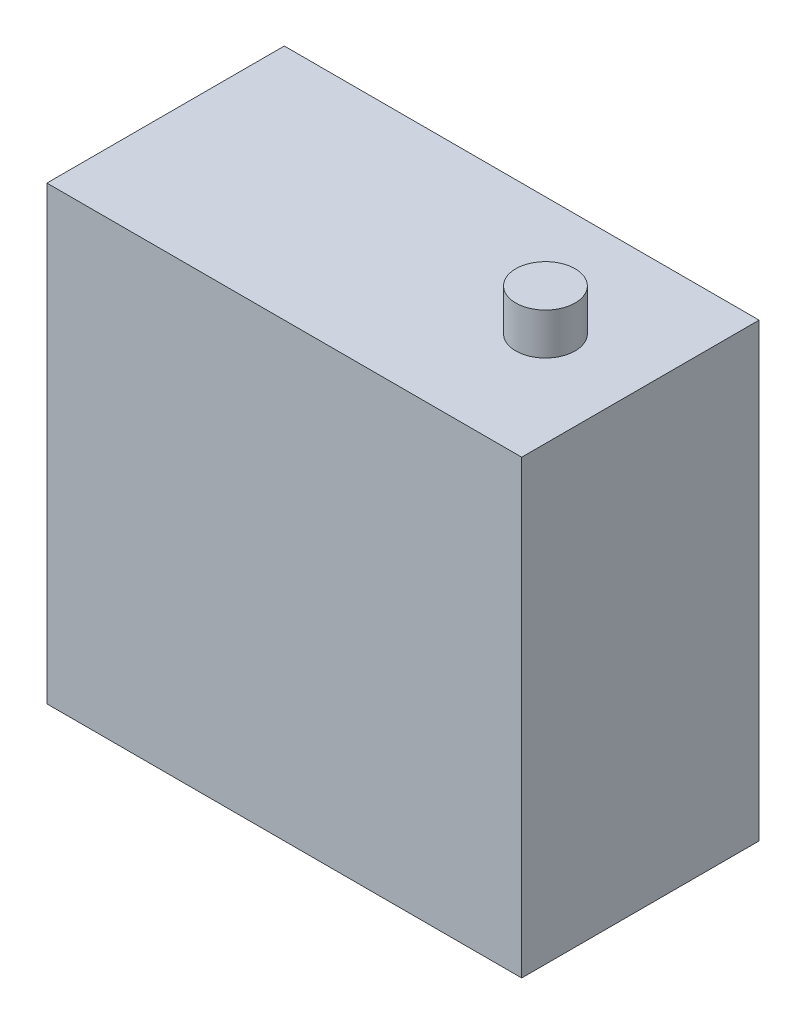
ISO-10303-21;
HEADER;
FILE_DESCRIPTION(('STEP AP214'),'2;1');
FILE_NAME('part.step','',(''),(''),'','','');
FILE_SCHEMA(('AUTOMOTIVE_DESIGN { 1 0 10303 214 1 1 1 1 }'));
ENDSEC;
DATA;
#1=APPLICATION_CONTEXT('core data for automotive mechanical design processes');
#2=APPLICATION_PROTOCOL_DEFINITION('international standard','automotive_design',2000,#1);
#3=PRODUCT_CONTEXT('',#1,'mechanical');
#4=PRODUCT('Part','Part','',(#3));
#5=PRODUCT_RELATED_PRODUCT_CATEGORY('part','',(#4));
#6=PRODUCT_DEFINITION_FORMATION('','',#4);
#7=PRODUCT_DEFINITION_CONTEXT('part definition',#1,'design');
#8=PRODUCT_DEFINITION('design','',#6,#7);
#9=PRODUCT_DEFINITION_SHAPE('','',#8);
#10=(LENGTH_UNIT() NAMED_UNIT(*) SI_UNIT(.MILLI.,.METRE.));
#11=(NAMED_UNIT(*) PLANE_ANGLE_UNIT() SI_UNIT($,.RADIAN.));
#12=(NAMED_UNIT(*) SI_UNIT($,.STERADIAN.) SOLID_ANGLE_UNIT());
#13=UNCERTAINTY_MEASURE_WITH_UNIT(LENGTH_MEASURE(1.E-05),#10,'distance_accuracy_value','');
#14=(GEOMETRIC_REPRESENTATION_CONTEXT(3) GLOBAL_UNCERTAINTY_ASSIGNED_CONTEXT((#13)) GLOBAL_UNIT_ASSIGNED_CONTEXT((#10,
#11,#12)) REPRESENTATION_CONTEXT('',''));
#15=CARTESIAN_POINT('',(0.,0.,0.));
#16=DIRECTION('',(0.,0.,1.));
#17=DIRECTION('',(1.,0.,0.));
#18=AXIS2_PLACEMENT_3D('',#15,#16,#17);
#19=CARTESIAN_POINT('',(-20.,38.,10.));
#20=DIRECTION('',(1.,0.,0.));
#21=DIRECTION('',(0.,0.,-1.));
#22=AXIS2_PLACEMENT_3D('',#19,#20,#21);
#23=PLANE('',#22);
#24=DIRECTION('',(0.,0.,1.));
#25=VECTOR('',#24,1.);
#26=CARTESIAN_POINT('',(-20.,0.,10.));
#27=LINE('',#26,#25);
#28=CARTESIAN_POINT('',(-20.,0.,-10.));
#29=VERTEX_POINT('',#28);
#30=CARTESIAN_POINT('',(-20.,0.,10.));
#31=VERTEX_POINT('',#30);
#32=EDGE_CURVE('E98',#29,#31,#27,.T.);
#33=ORIENTED_EDGE('',*,*,#32,.T.);
#34=DIRECTION('',(0.,-1.,0.));
#35=VECTOR('',#34,1.);
#36=CARTESIAN_POINT('',(-20.,38.,10.));
#37=LINE('',#36,#35);
#38=CARTESIAN_POINT('',(-20.,38.,10.));
#39=VERTEX_POINT('',#38);
#40=EDGE_CURVE('E11',#39,#31,#37,.T.);
#41=ORIENTED_EDGE('',*,*,#40,.F.);
#42=DIRECTION('',(0.,0.,1.));
#43=VECTOR('',#42,1.);
#44=CARTESIAN_POINT('',(-20.,38.,10.));
#45=LINE('',#44,#43);
#46=CARTESIAN_POINT('',(-20.,38.,-10.));
#47=VERTEX_POINT('',#46);
#48=EDGE_CURVE('E86',#47,#39,#45,.T.);
#49=ORIENTED_EDGE('',*,*,#48,.F.);
#50=DIRECTION('',(0.,-1.,0.));
#51=VECTOR('',#50,1.);
#52=CARTESIAN_POINT('',(-20.,38.,-10.));
#53=LINE('',#52,#51);
#54=EDGE_CURVE('E94',#47,#29,#53,.T.);
#55=ORIENTED_EDGE('',*,*,#54,.T.);
#56=EDGE_LOOP('',(#33,#41,#49,#55));
#57=FACE_BOUND('',#56,.T.);
#58=ADVANCED_FACE('F35',(#57),#23,.F.);
#59=CARTESIAN_POINT('',(20.,38.,10.));
#60=DIRECTION('',(0.,0.,-1.));
#61=DIRECTION('',(-1.,0.,0.));
#62=AXIS2_PLACEMENT_3D('',#59,#60,#61);
#63=PLANE('',#62);
#64=DIRECTION('',(1.,0.,0.));
#65=VECTOR('',#64,1.);
#66=CARTESIAN_POINT('',(20.,0.,10.));
#67=LINE('',#66,#65);
#68=CARTESIAN_POINT('',(20.,0.,10.));
#69=VERTEX_POINT('',#68);
#70=EDGE_CURVE('E90',#31,#69,#67,.T.);
#71=ORIENTED_EDGE('',*,*,#70,.T.);
#72=DIRECTION('',(0.,-1.,0.));
#73=VECTOR('',#72,1.);
#74=CARTESIAN_POINT('',(20.,38.,10.));
#75=LINE('',#74,#73);
#76=CARTESIAN_POINT('',(20.,38.,10.));
#77=VERTEX_POINT('',#76);
#78=EDGE_CURVE('E43',#77,#69,#75,.T.);
#79=ORIENTED_EDGE('',*,*,#78,.F.);
#80=DIRECTION('',(1.,0.,0.));
#81=VECTOR('',#80,1.);
#82=CARTESIAN_POINT('',(20.,38.,10.));
#83=LINE('',#82,#81);
#84=EDGE_CURVE('E81',#39,#77,#83,.T.);
#85=ORIENTED_EDGE('',*,*,#84,.F.);
#86=ORIENTED_EDGE('',*,*,#40,.T.);
#87=EDGE_LOOP('',(#71,#79,#85,#86));
#88=FACE_BOUND('',#87,.T.);
#89=ADVANCED_FACE('F89',(#88),#63,.F.);
#90=CARTESIAN_POINT('',(20.,38.,10.));
#91=DIRECTION('',(-1.,0.,0.));
#92=DIRECTION('',(0.,0.,1.));
#93=AXIS2_PLACEMENT_3D('',#90,#91,#92);
#94=PLANE('',#93);
#95=DIRECTION('',(0.,0.,-1.));
#96=VECTOR('',#95,1.);
#97=CARTESIAN_POINT('',(20.,0.,10.));
#98=LINE('',#97,#96);
#99=CARTESIAN_POINT('',(20.,0.,-10.));
#100=VERTEX_POINT('',#99);
#101=EDGE_CURVE('E68',#69,#100,#98,.T.);
#102=ORIENTED_EDGE('',*,*,#101,.T.);
#103=DIRECTION('',(0.,-1.,0.));
#104=VECTOR('',#103,1.);
#105=CARTESIAN_POINT('',(20.,38.,-10.));
#106=LINE('',#105,#104);
#107=CARTESIAN_POINT('',(20.,38.,-10.));
#108=VERTEX_POINT('',#107);
#109=EDGE_CURVE('E91',#108,#100,#106,.T.);
#110=ORIENTED_EDGE('',*,*,#109,.F.);
#111=DIRECTION('',(0.,0.,-1.));
#112=VECTOR('',#111,1.);
#113=CARTESIAN_POINT('',(20.,38.,10.));
#114=LINE('',#113,#112);
#115=EDGE_CURVE('E84',#77,#108,#114,.T.);
#116=ORIENTED_EDGE('',*,*,#115,.F.);
#117=ORIENTED_EDGE('',*,*,#78,.T.);
#118=EDGE_LOOP('',(#102,#110,#116,#117));
#119=FACE_BOUND('',#118,.T.);
#120=ADVANCED_FACE('F92',(#119),#94,.F.);
#121=CARTESIAN_POINT('',(20.,38.,-10.));
#122=DIRECTION('',(0.,0.,1.));
#123=DIRECTION('',(1.,0.,0.));
#124=AXIS2_PLACEMENT_3D('',#121,#122,#123);
#125=PLANE('',#124);
#126=DIRECTION('',(-1.,0.,0.));
#127=VECTOR('',#126,1.);
#128=CARTESIAN_POINT('',(20.,0.,-10.));
#129=LINE('',#128,#127);
#130=EDGE_CURVE('E74',#100,#29,#129,.T.);
#131=ORIENTED_EDGE('',*,*,#130,.T.);
#132=ORIENTED_EDGE('',*,*,#54,.F.);
#133=DIRECTION('',(-1.,0.,0.));
#134=VECTOR('',#133,1.);
#135=CARTESIAN_POINT('',(20.,38.,-10.));
#136=LINE('',#135,#134);
#137=EDGE_CURVE('E51',#108,#47,#136,.T.);
#138=ORIENTED_EDGE('',*,*,#137,.F.);
#139=ORIENTED_EDGE('',*,*,#109,.T.);
#140=EDGE_LOOP('',(#131,#132,#138,#139));
#141=FACE_BOUND('',#140,.T.);
#142=ADVANCED_FACE('F106',(#141),#125,.F.);
#143=CARTESIAN_POINT('',(0.,38.,0.));
#144=DIRECTION('',(0.,1.,0.));
#145=DIRECTION('',(0.,0.,1.));
#146=AXIS2_PLACEMENT_3D('',#143,#144,#145);
#147=PLANE('',#146);
#148=CARTESIAN_POINT('',(12.,38.,0.));
#149=DIRECTION('',(0.,1.,0.));
#150=DIRECTION('',(0.,0.,1.));
#151=AXIS2_PLACEMENT_3D('',#148,#149,#150);
#152=CIRCLE('',#151,2.5);
#153=CARTESIAN_POINT('',(12.,38.,2.5));
#154=VERTEX_POINT('',#153);
#155=EDGE_CURVE('E112',#154,#154,#152,.T.);
#156=ORIENTED_EDGE('',*,*,#155,.F.);
#157=EDGE_LOOP('',(#156));
#158=FACE_BOUND('',#157,.T.);
#159=ORIENTED_EDGE('',*,*,#48,.T.);
#160=ORIENTED_EDGE('',*,*,#84,.T.);
#161=ORIENTED_EDGE('',*,*,#115,.T.);
#162=ORIENTED_EDGE('',*,*,#137,.T.);
#163=EDGE_LOOP('',(#159,#160,#161,#162));
#164=FACE_BOUND('',#163,.T.);
#165=ADVANCED_FACE('F82',(#158,#164),#147,.T.);
#166=CARTESIAN_POINT('',(0.,0.,0.));
#167=DIRECTION('',(0.,1.,0.));
#168=DIRECTION('',(0.,0.,1.));
#169=AXIS2_PLACEMENT_3D('',#166,#167,#168);
#170=PLANE('',#169);
#171=ORIENTED_EDGE('',*,*,#32,.F.);
#172=ORIENTED_EDGE('',*,*,#130,.F.);
#173=ORIENTED_EDGE('',*,*,#101,.F.);
#174=ORIENTED_EDGE('',*,*,#70,.F.);
#175=EDGE_LOOP('',(#171,#172,#173,#174));
#176=FACE_BOUND('',#175,.T.);
#177=ADVANCED_FACE('F109',(#176),#170,.F.);
#178=CARTESIAN_POINT('',(12.,41.5,0.));
#179=DIRECTION('',(0.,-1.,0.));
#180=DIRECTION('',(0.,0.,-1.));
#181=AXIS2_PLACEMENT_3D('',#178,#179,#180);
#182=CYLINDRICAL_SURFACE('',#181,2.5);
#183=CARTESIAN_POINT('',(12.,41.5,0.));
#184=DIRECTION('',(0.,1.,0.));
#185=DIRECTION('',(0.,0.,1.));
#186=AXIS2_PLACEMENT_3D('',#183,#184,#185);
#187=CIRCLE('',#186,2.5);
#188=CARTESIAN_POINT('',(12.,41.5,2.5));
#189=VERTEX_POINT('',#188);
#190=EDGE_CURVE('E101',#189,#189,#187,.T.);
#191=ORIENTED_EDGE('',*,*,#190,.F.);
#192=EDGE_LOOP('',(#191));
#193=FACE_BOUND('',#192,.T.);
#194=ORIENTED_EDGE('',*,*,#155,.T.);
#195=EDGE_LOOP('',(#194));
#196=FACE_BOUND('',#195,.T.);
#197=ADVANCED_FACE('F120',(#193,#196),#182,.T.);
#198=CARTESIAN_POINT('',(12.,41.5,0.));
#199=DIRECTION('',(0.,1.,0.));
#200=DIRECTION('',(0.,0.,1.));
#201=AXIS2_PLACEMENT_3D('',#198,#199,#200);
#202=PLANE('',#201);
#203=ORIENTED_EDGE('',*,*,#190,.T.);
#204=EDGE_LOOP('',(#203));
#205=FACE_BOUND('',#204,.T.);
#206=ADVANCED_FACE('F118',(#205),#202,.T.);
#207=CLOSED_SHELL('',(#58,#89,#120,#142,#165,#177,#197,#206));
#208=MANIFOLD_SOLID_BREP('B2',#207);
#209=ADVANCED_BREP_SHAPE_REPRESENTATION('',(#18,#208),#14);
#210=SHAPE_DEFINITION_REPRESENTATION(#9,#209);
ENDSEC;
END-ISO-10303-21;
